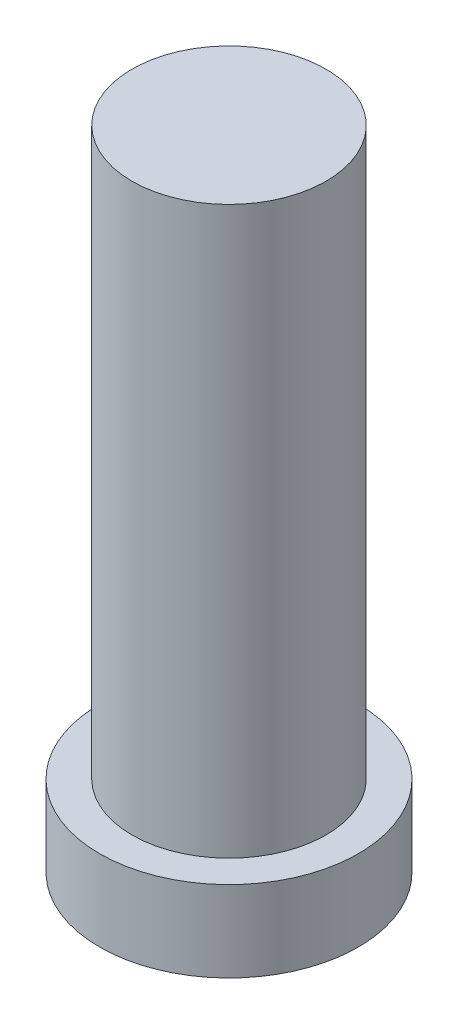
ISO-10303-21;
HEADER;
FILE_DESCRIPTION(('STEP AP214'),'2;1');
FILE_NAME('part.step','',(''),(''),'','','');
FILE_SCHEMA(('AUTOMOTIVE_DESIGN { 1 0 10303 214 1 1 1 1 }'));
ENDSEC;
DATA;
#1=APPLICATION_CONTEXT('core data for automotive mechanical design processes');
#2=APPLICATION_PROTOCOL_DEFINITION('international standard','automotive_design',2000,#1);
#3=PRODUCT_CONTEXT('',#1,'mechanical');
#4=PRODUCT('Part','Part','',(#3));
#5=PRODUCT_RELATED_PRODUCT_CATEGORY('part','',(#4));
#6=PRODUCT_DEFINITION_FORMATION('','',#4);
#7=PRODUCT_DEFINITION_CONTEXT('part definition',#1,'design');
#8=PRODUCT_DEFINITION('design','',#6,#7);
#9=PRODUCT_DEFINITION_SHAPE('','',#8);
#10=(LENGTH_UNIT() NAMED_UNIT(*) SI_UNIT(.MILLI.,.METRE.));
#11=(NAMED_UNIT(*) PLANE_ANGLE_UNIT() SI_UNIT($,.RADIAN.));
#12=(NAMED_UNIT(*) SI_UNIT($,.STERADIAN.) SOLID_ANGLE_UNIT());
#13=UNCERTAINTY_MEASURE_WITH_UNIT(LENGTH_MEASURE(1.E-05),#10,'distance_accuracy_value','');
#14=(GEOMETRIC_REPRESENTATION_CONTEXT(3) GLOBAL_UNCERTAINTY_ASSIGNED_CONTEXT((#13)) GLOBAL_UNIT_ASSIGNED_CONTEXT((#10,
#11,#12)) REPRESENTATION_CONTEXT('',''));
#15=CARTESIAN_POINT('',(0.,0.,0.));
#16=DIRECTION('',(0.,0.,1.));
#17=DIRECTION('',(1.,0.,0.));
#18=AXIS2_PLACEMENT_3D('',#15,#16,#17);
#19=CARTESIAN_POINT('',(0.,-50.,0.));
#20=DIRECTION('',(0.,1.,0.));
#21=DIRECTION('',(0.,0.,1.));
#22=AXIS2_PLACEMENT_3D('',#19,#20,#21);
#23=CYLINDRICAL_SURFACE('',#22,80.);
#24=CARTESIAN_POINT('',(0.,-50.,0.));
#25=DIRECTION('',(0.,1.,0.));
#26=DIRECTION('',(0.,0.,1.));
#27=AXIS2_PLACEMENT_3D('',#24,#25,#26);
#28=CIRCLE('',#27,80.);
#29=CARTESIAN_POINT('',(0.,-50.,80.));
#30=VERTEX_POINT('',#29);
#31=EDGE_CURVE('E40',#30,#30,#28,.T.);
#32=ORIENTED_EDGE('',*,*,#31,.T.);
#33=EDGE_LOOP('',(#32));
#34=FACE_BOUND('',#33,.T.);
#35=CARTESIAN_POINT('',(0.,0.,0.));
#36=DIRECTION('',(0.,1.,0.));
#37=DIRECTION('',(0.,0.,1.));
#38=AXIS2_PLACEMENT_3D('',#35,#36,#37);
#39=CIRCLE('',#38,80.);
#40=CARTESIAN_POINT('',(0.,0.,80.));
#41=VERTEX_POINT('',#40);
#42=EDGE_CURVE('E36',#41,#41,#39,.T.);
#43=ORIENTED_EDGE('',*,*,#42,.F.);
#44=EDGE_LOOP('',(#43));
#45=FACE_BOUND('',#44,.T.);
#46=ADVANCED_FACE('F33',(#34,#45),#23,.T.);
#47=CARTESIAN_POINT('',(0.,-50.,0.));
#48=DIRECTION('',(0.,1.,0.));
#49=DIRECTION('',(0.,0.,1.));
#50=AXIS2_PLACEMENT_3D('',#47,#48,#49);
#51=PLANE('',#50);
#52=ORIENTED_EDGE('',*,*,#31,.F.);
#53=EDGE_LOOP('',(#52));
#54=FACE_BOUND('',#53,.T.);
#55=ADVANCED_FACE('F56',(#54),#51,.F.);
#56=CARTESIAN_POINT('',(0.,0.,0.));
#57=DIRECTION('',(0.,1.,0.));
#58=DIRECTION('',(0.,0.,1.));
#59=AXIS2_PLACEMENT_3D('',#56,#57,#58);
#60=PLANE('',#59);
#61=CARTESIAN_POINT('',(0.,0.,0.));
#62=DIRECTION('',(0.,1.,0.));
#63=DIRECTION('',(0.,0.,1.));
#64=AXIS2_PLACEMENT_3D('',#61,#62,#63);
#65=CIRCLE('',#64,60.);
#66=CARTESIAN_POINT('',(0.,0.,60.));
#67=VERTEX_POINT('',#66);
#68=EDGE_CURVE('E10',#67,#67,#65,.T.);
#69=ORIENTED_EDGE('',*,*,#68,.F.);
#70=EDGE_LOOP('',(#69));
#71=FACE_BOUND('',#70,.T.);
#72=ORIENTED_EDGE('',*,*,#42,.T.);
#73=EDGE_LOOP('',(#72));
#74=FACE_BOUND('',#73,.T.);
#75=ADVANCED_FACE('F53',(#71,#74),#60,.T.);
#76=CARTESIAN_POINT('',(0.,350.,0.));
#77=DIRECTION('',(0.,-1.,0.));
#78=DIRECTION('',(0.,0.,-1.));
#79=AXIS2_PLACEMENT_3D('',#76,#77,#78);
#80=CYLINDRICAL_SURFACE('',#79,60.);
#81=CARTESIAN_POINT('',(0.,350.,0.));
#82=DIRECTION('',(0.,1.,0.));
#83=DIRECTION('',(0.,0.,1.));
#84=AXIS2_PLACEMENT_3D('',#81,#82,#83);
#85=CIRCLE('',#84,60.);
#86=CARTESIAN_POINT('',(0.,350.,60.));
#87=VERTEX_POINT('',#86);
#88=EDGE_CURVE('E46',#87,#87,#85,.T.);
#89=ORIENTED_EDGE('',*,*,#88,.F.);
#90=EDGE_LOOP('',(#89));
#91=FACE_BOUND('',#90,.T.);
#92=ORIENTED_EDGE('',*,*,#68,.T.);
#93=EDGE_LOOP('',(#92));
#94=FACE_BOUND('',#93,.T.);
#95=ADVANCED_FACE('F67',(#91,#94),#80,.T.);
#96=CARTESIAN_POINT('',(0.,350.,0.));
#97=DIRECTION('',(0.,1.,0.));
#98=DIRECTION('',(0.,0.,1.));
#99=AXIS2_PLACEMENT_3D('',#96,#97,#98);
#100=PLANE('',#99);
#101=ORIENTED_EDGE('',*,*,#88,.T.);
#102=EDGE_LOOP('',(#101));
#103=FACE_BOUND('',#102,.T.);
#104=ADVANCED_FACE('F72',(#103),#100,.T.);
#105=CLOSED_SHELL('',(#46,#55,#75,#95,#104));
#106=MANIFOLD_SOLID_BREP('B2',#105);
#107=ADVANCED_BREP_SHAPE_REPRESENTATION('',(#18,#106),#14);
#108=SHAPE_DEFINITION_REPRESENTATION(#9,#107);
ENDSEC;
END-ISO-10303-21;
